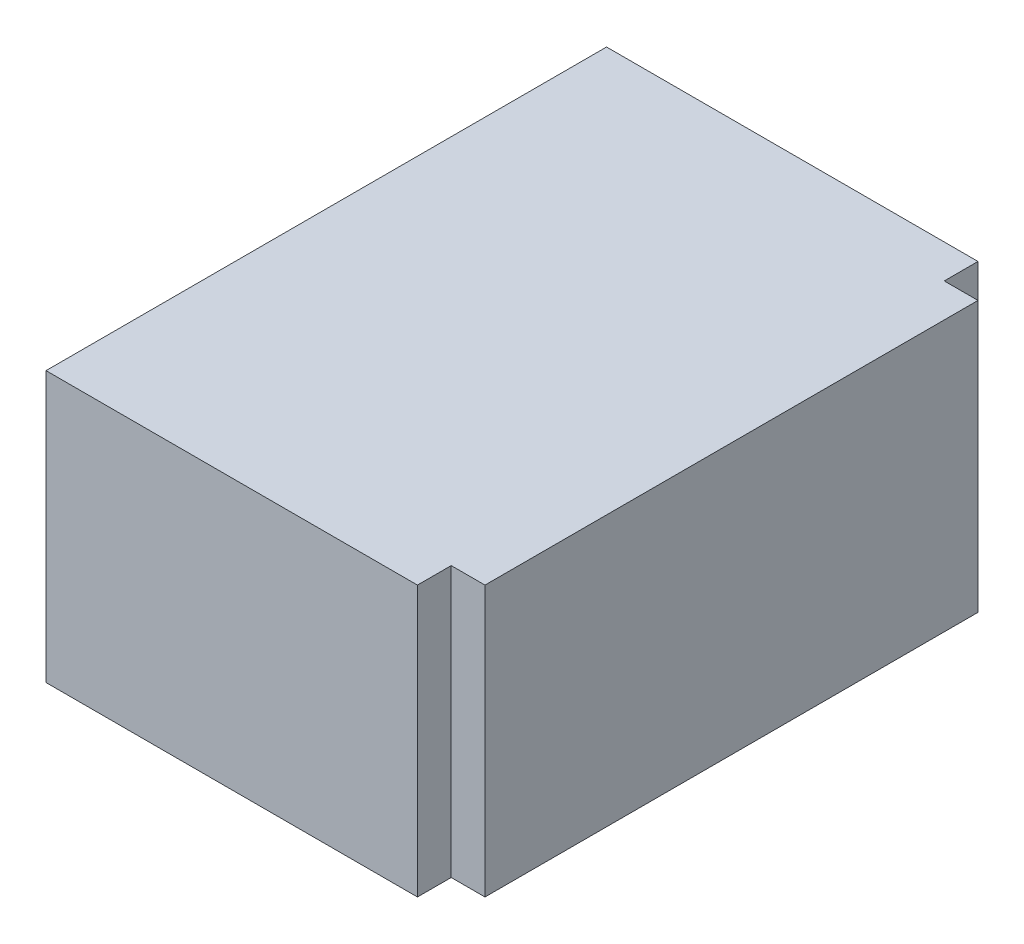
ISO-10303-21;
HEADER;
FILE_DESCRIPTION(('STEP AP214'),'2;1');
FILE_NAME('part.step','',(''),(''),'','','');
FILE_SCHEMA(('AUTOMOTIVE_DESIGN { 1 0 10303 214 1 1 1 1 }'));
ENDSEC;
DATA;
#1=APPLICATION_CONTEXT('core data for automotive mechanical design processes');
#2=APPLICATION_PROTOCOL_DEFINITION('international standard','automotive_design',2000,#1);
#3=PRODUCT_CONTEXT('',#1,'mechanical');
#4=PRODUCT('Part','Part','',(#3));
#5=PRODUCT_RELATED_PRODUCT_CATEGORY('part','',(#4));
#6=PRODUCT_DEFINITION_FORMATION('','',#4);
#7=PRODUCT_DEFINITION_CONTEXT('part definition',#1,'design');
#8=PRODUCT_DEFINITION('design','',#6,#7);
#9=PRODUCT_DEFINITION_SHAPE('','',#8);
#10=(LENGTH_UNIT() NAMED_UNIT(*) SI_UNIT(.MILLI.,.METRE.));
#11=(NAMED_UNIT(*) PLANE_ANGLE_UNIT() SI_UNIT($,.RADIAN.));
#12=(NAMED_UNIT(*) SI_UNIT($,.STERADIAN.) SOLID_ANGLE_UNIT());
#13=UNCERTAINTY_MEASURE_WITH_UNIT(LENGTH_MEASURE(1.E-05),#10,'distance_accuracy_value','');
#14=(GEOMETRIC_REPRESENTATION_CONTEXT(3) GLOBAL_UNCERTAINTY_ASSIGNED_CONTEXT((#13)) GLOBAL_UNIT_ASSIGNED_CONTEXT((#10,
#11,#12)) REPRESENTATION_CONTEXT('',''));
#15=CARTESIAN_POINT('',(0.,0.,0.));
#16=DIRECTION('',(0.,0.,1.));
#17=DIRECTION('',(1.,0.,0.));
#18=AXIS2_PLACEMENT_3D('',#15,#16,#17);
#19=CARTESIAN_POINT('',(-5.,0.402182955516719,-4.91231665760501));
#20=DIRECTION('',(1.,0.,0.));
#21=DIRECTION('',(0.,0.,-1.));
#22=AXIS2_PLACEMENT_3D('',#19,#20,#21);
#23=PLANE('',#22);
#24=DIRECTION('',(0.,-0.206333700962019,-0.978481682939091));
#25=VECTOR('',#24,1.);
#26=CARTESIAN_POINT('',(-5.,-0.672010625915505,-3.94824120259998));
#27=LINE('',#26,#25);
#28=CARTESIAN_POINT('',(-5.,-0.672010625915505,-3.94824120259998));
#29=VERTEX_POINT('',#28);
#30=CARTESIAN_POINT('',(-5.,-0.374193581432222,-2.53592454499497));
#31=VERTEX_POINT('',#30);
#32=EDGE_CURVE('E279',#29,#31,#27,.F.);
#33=ORIENTED_EDGE('',*,*,#32,.T.);
#34=DIRECTION('',(0.,-0.950556845044013,-0.310550614779576));
#35=VECTOR('',#34,1.);
#36=CARTESIAN_POINT('',(-5.,-0.374193581432222,-2.53592454499497));
#37=LINE('',#36,#35);
#38=CARTESIAN_POINT('',(-5.,0.997817044483285,-2.08768334239499));
#39=VERTEX_POINT('',#38);
#40=EDGE_CURVE('E285',#31,#39,#37,.F.);
#41=ORIENTED_EDGE('',*,*,#40,.T.);
#42=DIRECTION('',(0.,-0.744223144081993,0.667931068159516));
#43=VECTOR('',#42,1.);
#44=CARTESIAN_POINT('',(-5.,0.997817044483285,-2.08768334239499));
#45=LINE('',#44,#43);
#46=CARTESIAN_POINT('',(-5.,2.07201062591551,-3.05175879740002));
#47=VERTEX_POINT('',#46);
#48=EDGE_CURVE('E291',#39,#47,#45,.F.);
#49=ORIENTED_EDGE('',*,*,#48,.T.);
#50=DIRECTION('',(0.,0.20633370096202,0.978481682939091));
#51=VECTOR('',#50,1.);
#52=CARTESIAN_POINT('',(-5.,2.07201062591551,-3.05175879740002));
#53=LINE('',#52,#51);
#54=CARTESIAN_POINT('',(-5.,1.77419358143222,-4.46407545500503));
#55=VERTEX_POINT('',#54);
#56=EDGE_CURVE('E170',#47,#55,#53,.F.);
#57=ORIENTED_EDGE('',*,*,#56,.T.);
#58=DIRECTION('',(0.,0.950556845044013,0.310550614779576));
#59=VECTOR('',#58,1.);
#60=CARTESIAN_POINT('',(-5.,1.77419358143222,-4.46407545500503));
#61=LINE('',#60,#59);
#62=CARTESIAN_POINT('',(-5.,0.402182955516719,-4.91231665760501));
#63=VERTEX_POINT('',#62);
#64=EDGE_CURVE('E152',#55,#63,#61,.F.);
#65=ORIENTED_EDGE('',*,*,#64,.T.);
#66=DIRECTION('',(0.,0.744223144081994,-0.667931068159516));
#67=VECTOR('',#66,1.);
#68=CARTESIAN_POINT('',(-5.,0.402182955516719,-4.91231665760501));
#69=LINE('',#68,#67);
#70=EDGE_CURVE('E158',#63,#29,#69,.F.);
#71=ORIENTED_EDGE('',*,*,#70,.T.);
#72=EDGE_LOOP('',(#33,#41,#49,#57,#65,#71));
#73=FACE_BOUND('',#72,.T.);
#74=ADVANCED_FACE('F16',(#73),#23,.F.);
#75=CARTESIAN_POINT('',(-5.,-0.743270718999248,3.51740589017356));
#76=DIRECTION('',(1.,0.,0.));
#77=DIRECTION('',(0.,0.,-1.));
#78=AXIS2_PLACEMENT_3D('',#75,#76,#77);
#79=PLANE('',#78);
#80=DIRECTION('',(0.,-0.999927285753263,0.0120591544526271));
#81=VECTOR('',#80,1.);
#82=CARTESIAN_POINT('',(-5.,-0.00656141643384333,4.75861205227836));
#83=LINE('',#82,#81);
#84=CARTESIAN_POINT('',(-5.,-0.0065614164338432,4.75861205227836));
#85=VERTEX_POINT('',#84);
#86=CARTESIAN_POINT('',(-5.,1.43670930256541,4.7412061621048));
#87=VERTEX_POINT('',#86);
#88=EDGE_CURVE('E244',#85,#87,#83,.F.);
#89=ORIENTED_EDGE('',*,*,#88,.T.);
#90=DIRECTION('',(0.,-0.489520108772496,0.871992008625861));
#91=VECTOR('',#90,1.);
#92=CARTESIAN_POINT('',(-5.,1.43670930256541,4.7412061621048));
#93=LINE('',#92,#91);
#94=CARTESIAN_POINT('',(-5.,2.14327071899925,3.48259410982644));
#95=VERTEX_POINT('',#94);
#96=EDGE_CURVE('E253',#87,#95,#93,.F.);
#97=ORIENTED_EDGE('',*,*,#96,.T.);
#98=DIRECTION('',(0.,0.510407176980768,0.859932854173233));
#99=VECTOR('',#98,1.);
#100=CARTESIAN_POINT('',(-5.,2.14327071899925,3.48259410982644));
#101=LINE('',#100,#99);
#102=CARTESIAN_POINT('',(-5.,1.40656141643384,2.24138794772164));
#103=VERTEX_POINT('',#102);
#104=EDGE_CURVE('E259',#95,#103,#101,.F.);
#105=ORIENTED_EDGE('',*,*,#104,.T.);
#106=DIRECTION('',(0.,0.999927285753263,-0.0120591544526262));
#107=VECTOR('',#106,1.);
#108=CARTESIAN_POINT('',(-5.,1.40656141643384,2.24138794772164));
#109=LINE('',#108,#107);
#110=CARTESIAN_POINT('',(-5.,-0.0367093025654058,2.2587938378952));
#111=VERTEX_POINT('',#110);
#112=EDGE_CURVE('E265',#103,#111,#109,.F.);
#113=ORIENTED_EDGE('',*,*,#112,.T.);
#114=DIRECTION('',(0.,0.489520108772496,-0.871992008625861));
#115=VECTOR('',#114,1.);
#116=CARTESIAN_POINT('',(-5.,-0.0367093025654059,2.2587938378952));
#117=LINE('',#116,#115);
#118=CARTESIAN_POINT('',(-5.,-0.743270718999248,3.51740589017356));
#119=VERTEX_POINT('',#118);
#120=EDGE_CURVE('E271',#111,#119,#117,.F.);
#121=ORIENTED_EDGE('',*,*,#120,.T.);
#122=DIRECTION('',(0.,-0.510407176980767,-0.859932854173234));
#123=VECTOR('',#122,1.);
#124=CARTESIAN_POINT('',(-5.,-0.743270718999248,3.51740589017356));
#125=LINE('',#124,#123);
#126=EDGE_CURVE('E274',#119,#85,#125,.F.);
#127=ORIENTED_EDGE('',*,*,#126,.T.);
#128=EDGE_LOOP('',(#89,#97,#105,#113,#121,#127));
#129=FACE_BOUND('',#128,.T.);
#130=ADVANCED_FACE('F620',(#129),#79,.F.);
#131=CARTESIAN_POINT('',(-5.,0.402182955516719,-4.91231665760501));
#132=DIRECTION('',(0.,-0.667931068159516,-0.744223144081994));
#133=DIRECTION('',(0.,0.744223144081994,-0.667931068159516));
#134=AXIS2_PLACEMENT_3D('',#131,#132,#133);
#135=PLANE('',#134);
#136=DIRECTION('',(1.,0.,0.));
#137=VECTOR('',#136,1.);
#138=CARTESIAN_POINT('',(-5.,-0.672010625915505,-3.94824120259998));
#139=LINE('',#138,#137);
#140=CARTESIAN_POINT('',(-6.,-0.672010625915505,-3.94824120259998));
#141=VERTEX_POINT('',#140);
#142=EDGE_CURVE('E163',#141,#29,#139,.T.);
#143=ORIENTED_EDGE('',*,*,#142,.T.);
#144=ORIENTED_EDGE('',*,*,#70,.F.);
#145=DIRECTION('',(1.,0.,0.));
#146=VECTOR('',#145,1.);
#147=CARTESIAN_POINT('',(-5.,0.402182955516719,-4.91231665760501));
#148=LINE('',#147,#146);
#149=CARTESIAN_POINT('',(-6.,0.402182955516719,-4.91231665760501));
#150=VERTEX_POINT('',#149);
#151=EDGE_CURVE('E161',#63,#150,#148,.F.);
#152=ORIENTED_EDGE('',*,*,#151,.T.);
#153=DIRECTION('',(0.,0.744223144081994,-0.667931068159516));
#154=VECTOR('',#153,1.);
#155=CARTESIAN_POINT('',(-6.,-0.672010625915505,-3.94824120259998));
#156=LINE('',#155,#154);
#157=EDGE_CURVE('E239',#141,#150,#156,.T.);
#158=ORIENTED_EDGE('',*,*,#157,.F.);
#159=EDGE_LOOP('',(#143,#144,#152,#158));
#160=FACE_BOUND('',#159,.T.);
#161=ADVANCED_FACE('F159',(#160),#135,.F.);
#162=CARTESIAN_POINT('',(-5.,1.77419358143222,-4.46407545500503));
#163=DIRECTION('',(0.,0.310550614779576,-0.950556845044013));
#164=DIRECTION('',(0.,0.950556845044013,0.310550614779576));
#165=AXIS2_PLACEMENT_3D('',#162,#163,#164);
#166=PLANE('',#165);
#167=ORIENTED_EDGE('',*,*,#151,.F.);
#168=ORIENTED_EDGE('',*,*,#64,.F.);
#169=DIRECTION('',(1.,0.,0.));
#170=VECTOR('',#169,1.);
#171=CARTESIAN_POINT('',(-5.,1.77419358143222,-4.46407545500503));
#172=LINE('',#171,#170);
#173=CARTESIAN_POINT('',(-6.,1.77419358143222,-4.46407545500503));
#174=VERTEX_POINT('',#173);
#175=EDGE_CURVE('E293',#55,#174,#172,.F.);
#176=ORIENTED_EDGE('',*,*,#175,.T.);
#177=DIRECTION('',(0.,0.950556845044013,0.310550614779576));
#178=VECTOR('',#177,1.);
#179=CARTESIAN_POINT('',(-6.,0.402182955516719,-4.91231665760501));
#180=LINE('',#179,#178);
#181=EDGE_CURVE('E169',#150,#174,#180,.T.);
#182=ORIENTED_EDGE('',*,*,#181,.F.);
#183=EDGE_LOOP('',(#167,#168,#176,#182));
#184=FACE_BOUND('',#183,.T.);
#185=ADVANCED_FACE('F168',(#184),#166,.F.);
#186=CARTESIAN_POINT('',(-5.,2.07201062591551,-3.05175879740002));
#187=DIRECTION('',(0.,0.978481682939091,-0.20633370096202));
#188=DIRECTION('',(0.,0.20633370096202,0.978481682939091));
#189=AXIS2_PLACEMENT_3D('',#186,#187,#188);
#190=PLANE('',#189);
#191=ORIENTED_EDGE('',*,*,#175,.F.);
#192=ORIENTED_EDGE('',*,*,#56,.F.);
#193=DIRECTION('',(1.,0.,0.));
#194=VECTOR('',#193,1.);
#195=CARTESIAN_POINT('',(-5.,2.07201062591551,-3.05175879740002));
#196=LINE('',#195,#194);
#197=CARTESIAN_POINT('',(-6.,2.07201062591551,-3.05175879740002));
#198=VERTEX_POINT('',#197);
#199=EDGE_CURVE('E288',#47,#198,#196,.F.);
#200=ORIENTED_EDGE('',*,*,#199,.T.);
#201=DIRECTION('',(0.,0.20633370096202,0.978481682939091));
#202=VECTOR('',#201,1.);
#203=CARTESIAN_POINT('',(-6.,1.77419358143222,-4.46407545500503));
#204=LINE('',#203,#202);
#205=EDGE_CURVE('E236',#174,#198,#204,.T.);
#206=ORIENTED_EDGE('',*,*,#205,.F.);
#207=EDGE_LOOP('',(#191,#192,#200,#206));
#208=FACE_BOUND('',#207,.T.);
#209=ADVANCED_FACE('F296',(#208),#190,.F.);
#210=CARTESIAN_POINT('',(-5.,0.997817044483285,-2.08768334239499));
#211=DIRECTION('',(0.,0.667931068159516,0.744223144081993));
#212=DIRECTION('',(0.,-0.744223144081993,0.667931068159516));
#213=AXIS2_PLACEMENT_3D('',#210,#211,#212);
#214=PLANE('',#213);
#215=ORIENTED_EDGE('',*,*,#199,.F.);
#216=ORIENTED_EDGE('',*,*,#48,.F.);
#217=DIRECTION('',(1.,0.,0.));
#218=VECTOR('',#217,1.);
#219=CARTESIAN_POINT('',(-5.,0.997817044483285,-2.08768334239499));
#220=LINE('',#219,#218);
#221=CARTESIAN_POINT('',(-6.,0.997817044483285,-2.08768334239499));
#222=VERTEX_POINT('',#221);
#223=EDGE_CURVE('E282',#39,#222,#220,.F.);
#224=ORIENTED_EDGE('',*,*,#223,.T.);
#225=DIRECTION('',(0.,-0.744223144081993,0.667931068159517));
#226=VECTOR('',#225,1.);
#227=CARTESIAN_POINT('',(-6.,2.07201062591551,-3.05175879740002));
#228=LINE('',#227,#226);
#229=EDGE_CURVE('E234',#198,#222,#228,.T.);
#230=ORIENTED_EDGE('',*,*,#229,.F.);
#231=EDGE_LOOP('',(#215,#216,#224,#230));
#232=FACE_BOUND('',#231,.T.);
#233=ADVANCED_FACE('F310',(#232),#214,.F.);
#234=CARTESIAN_POINT('',(-5.,-0.374193581432222,-2.53592454499497));
#235=DIRECTION('',(0.,-0.310550614779576,0.950556845044013));
#236=DIRECTION('',(0.,-0.950556845044013,-0.310550614779576));
#237=AXIS2_PLACEMENT_3D('',#234,#235,#236);
#238=PLANE('',#237);
#239=ORIENTED_EDGE('',*,*,#223,.F.);
#240=ORIENTED_EDGE('',*,*,#40,.F.);
#241=DIRECTION('',(1.,0.,0.));
#242=VECTOR('',#241,1.);
#243=CARTESIAN_POINT('',(-5.,-0.374193581432222,-2.53592454499497));
#244=LINE('',#243,#242);
#245=CARTESIAN_POINT('',(-6.,-0.374193581432222,-2.53592454499497));
#246=VERTEX_POINT('',#245);
#247=EDGE_CURVE('E276',#31,#246,#244,.F.);
#248=ORIENTED_EDGE('',*,*,#247,.T.);
#249=DIRECTION('',(0.,-0.950556845044013,-0.310550614779576));
#250=VECTOR('',#249,1.);
#251=CARTESIAN_POINT('',(-6.,0.997817044483285,-2.08768334239499));
#252=LINE('',#251,#250);
#253=EDGE_CURVE('E232',#222,#246,#252,.T.);
#254=ORIENTED_EDGE('',*,*,#253,.F.);
#255=EDGE_LOOP('',(#239,#240,#248,#254));
#256=FACE_BOUND('',#255,.T.);
#257=ADVANCED_FACE('F308',(#256),#238,.F.);
#258=CARTESIAN_POINT('',(-5.,-0.672010625915505,-3.94824120259998));
#259=DIRECTION('',(0.,-0.978481682939091,0.206333700962019));
#260=DIRECTION('',(0.,-0.206333700962019,-0.978481682939091));
#261=AXIS2_PLACEMENT_3D('',#258,#259,#260);
#262=PLANE('',#261);
#263=ORIENTED_EDGE('',*,*,#247,.F.);
#264=ORIENTED_EDGE('',*,*,#32,.F.);
#265=ORIENTED_EDGE('',*,*,#142,.F.);
#266=DIRECTION('',(0.,-0.206333700962019,-0.978481682939091));
#267=VECTOR('',#266,1.);
#268=CARTESIAN_POINT('',(-6.,-0.374193581432222,-2.53592454499497));
#269=LINE('',#268,#267);
#270=EDGE_CURVE('E229',#246,#141,#269,.T.);
#271=ORIENTED_EDGE('',*,*,#270,.F.);
#272=EDGE_LOOP('',(#263,#264,#265,#271));
#273=FACE_BOUND('',#272,.T.);
#274=ADVANCED_FACE('F305',(#273),#262,.F.);
#275=CARTESIAN_POINT('',(-5.,-0.743270718999248,3.51740589017356));
#276=DIRECTION('',(0.,-0.859932854173234,0.510407176980767));
#277=DIRECTION('',(0.,-0.510407176980767,-0.859932854173234));
#278=AXIS2_PLACEMENT_3D('',#275,#276,#277);
#279=PLANE('',#278);
#280=DIRECTION('',(1.,0.,0.));
#281=VECTOR('',#280,1.);
#282=CARTESIAN_POINT('',(-5.,-0.00656141643384336,4.75861205227836));
#283=LINE('',#282,#281);
#284=CARTESIAN_POINT('',(-6.,-0.0065614164338432,4.75861205227836));
#285=VERTEX_POINT('',#284);
#286=EDGE_CURVE('E247',#285,#85,#283,.T.);
#287=ORIENTED_EDGE('',*,*,#286,.T.);
#288=ORIENTED_EDGE('',*,*,#126,.F.);
#289=DIRECTION('',(1.,0.,0.));
#290=VECTOR('',#289,1.);
#291=CARTESIAN_POINT('',(-5.,-0.743270718999248,3.51740589017356));
#292=LINE('',#291,#290);
#293=CARTESIAN_POINT('',(-6.,-0.743270718999248,3.51740589017356));
#294=VERTEX_POINT('',#293);
#295=EDGE_CURVE('E268',#119,#294,#292,.F.);
#296=ORIENTED_EDGE('',*,*,#295,.T.);
#297=DIRECTION('',(0.,-0.510407176980766,-0.859932854173234));
#298=VECTOR('',#297,1.);
#299=CARTESIAN_POINT('',(-6.,-0.00656141643384333,4.75861205227836));
#300=LINE('',#299,#298);
#301=EDGE_CURVE('E227',#285,#294,#300,.T.);
#302=ORIENTED_EDGE('',*,*,#301,.F.);
#303=EDGE_LOOP('',(#287,#288,#296,#302));
#304=FACE_BOUND('',#303,.T.);
#305=ADVANCED_FACE('F419',(#304),#279,.F.);
#306=CARTESIAN_POINT('',(-5.,-0.0367093025654059,2.2587938378952));
#307=DIRECTION('',(0.,-0.871992008625861,-0.489520108772496));
#308=DIRECTION('',(0.,0.489520108772496,-0.871992008625861));
#309=AXIS2_PLACEMENT_3D('',#306,#307,#308);
#310=PLANE('',#309);
#311=ORIENTED_EDGE('',*,*,#295,.F.);
#312=ORIENTED_EDGE('',*,*,#120,.F.);
#313=DIRECTION('',(1.,0.,0.));
#314=VECTOR('',#313,1.);
#315=CARTESIAN_POINT('',(-5.,-0.0367093025654059,2.2587938378952));
#316=LINE('',#315,#314);
#317=CARTESIAN_POINT('',(-6.,-0.0367093025654059,2.2587938378952));
#318=VERTEX_POINT('',#317);
#319=EDGE_CURVE('E262',#111,#318,#316,.F.);
#320=ORIENTED_EDGE('',*,*,#319,.T.);
#321=DIRECTION('',(0.,0.489520108772496,-0.871992008625861));
#322=VECTOR('',#321,1.);
#323=CARTESIAN_POINT('',(-6.,-0.743270718999248,3.51740589017356));
#324=LINE('',#323,#322);
#325=EDGE_CURVE('E225',#294,#318,#324,.T.);
#326=ORIENTED_EDGE('',*,*,#325,.F.);
#327=EDGE_LOOP('',(#311,#312,#320,#326));
#328=FACE_BOUND('',#327,.T.);
#329=ADVANCED_FACE('F415',(#328),#310,.F.);
#330=CARTESIAN_POINT('',(-5.,1.40656141643384,2.24138794772164));
#331=DIRECTION('',(0.,-0.0120591544526262,-0.999927285753263));
#332=DIRECTION('',(0.,0.999927285753263,-0.0120591544526262));
#333=AXIS2_PLACEMENT_3D('',#330,#331,#332);
#334=PLANE('',#333);
#335=ORIENTED_EDGE('',*,*,#319,.F.);
#336=ORIENTED_EDGE('',*,*,#112,.F.);
#337=DIRECTION('',(1.,0.,0.));
#338=VECTOR('',#337,1.);
#339=CARTESIAN_POINT('',(-5.,1.40656141643384,2.24138794772164));
#340=LINE('',#339,#338);
#341=CARTESIAN_POINT('',(-6.,1.40656141643384,2.24138794772164));
#342=VERTEX_POINT('',#341);
#343=EDGE_CURVE('E256',#103,#342,#340,.F.);
#344=ORIENTED_EDGE('',*,*,#343,.T.);
#345=DIRECTION('',(0.,0.999927285753263,-0.0120591544526262));
#346=VECTOR('',#345,1.);
#347=CARTESIAN_POINT('',(-6.,-0.0367093025654059,2.2587938378952));
#348=LINE('',#347,#346);
#349=EDGE_CURVE('E223',#318,#342,#348,.T.);
#350=ORIENTED_EDGE('',*,*,#349,.F.);
#351=EDGE_LOOP('',(#335,#336,#344,#350));
#352=FACE_BOUND('',#351,.T.);
#353=ADVANCED_FACE('F411',(#352),#334,.F.);
#354=CARTESIAN_POINT('',(-5.,2.14327071899925,3.48259410982644));
#355=DIRECTION('',(0.,0.859932854173233,-0.510407176980768));
#356=DIRECTION('',(0.,0.510407176980768,0.859932854173233));
#357=AXIS2_PLACEMENT_3D('',#354,#355,#356);
#358=PLANE('',#357);
#359=ORIENTED_EDGE('',*,*,#343,.F.);
#360=ORIENTED_EDGE('',*,*,#104,.F.);
#361=DIRECTION('',(1.,0.,0.));
#362=VECTOR('',#361,1.);
#363=CARTESIAN_POINT('',(-5.,2.14327071899925,3.48259410982644));
#364=LINE('',#363,#362);
#365=CARTESIAN_POINT('',(-6.,2.14327071899925,3.48259410982644));
#366=VERTEX_POINT('',#365);
#367=EDGE_CURVE('E250',#95,#366,#364,.F.);
#368=ORIENTED_EDGE('',*,*,#367,.T.);
#369=DIRECTION('',(0.,0.510407176980767,0.859932854173233));
#370=VECTOR('',#369,1.);
#371=CARTESIAN_POINT('',(-6.,1.40656141643384,2.24138794772164));
#372=LINE('',#371,#370);
#373=EDGE_CURVE('E218',#342,#366,#372,.T.);
#374=ORIENTED_EDGE('',*,*,#373,.F.);
#375=EDGE_LOOP('',(#359,#360,#368,#374));
#376=FACE_BOUND('',#375,.T.);
#377=ADVANCED_FACE('F407',(#376),#358,.F.);
#378=CARTESIAN_POINT('',(-5.,1.43670930256541,4.7412061621048));
#379=DIRECTION('',(0.,0.871992008625861,0.489520108772496));
#380=DIRECTION('',(0.,-0.489520108772496,0.871992008625861));
#381=AXIS2_PLACEMENT_3D('',#378,#379,#380);
#382=PLANE('',#381);
#383=ORIENTED_EDGE('',*,*,#367,.F.);
#384=ORIENTED_EDGE('',*,*,#96,.F.);
#385=DIRECTION('',(1.,0.,0.));
#386=VECTOR('',#385,1.);
#387=CARTESIAN_POINT('',(-5.,1.43670930256541,4.7412061621048));
#388=LINE('',#387,#386);
#389=CARTESIAN_POINT('',(-6.,1.43670930256541,4.7412061621048));
#390=VERTEX_POINT('',#389);
#391=EDGE_CURVE('E241',#87,#390,#388,.F.);
#392=ORIENTED_EDGE('',*,*,#391,.T.);
#393=DIRECTION('',(0.,-0.489520108772496,0.871992008625861));
#394=VECTOR('',#393,1.);
#395=CARTESIAN_POINT('',(-6.,2.14327071899925,3.48259410982644));
#396=LINE('',#395,#394);
#397=EDGE_CURVE('E213',#366,#390,#396,.T.);
#398=ORIENTED_EDGE('',*,*,#397,.F.);
#399=EDGE_LOOP('',(#383,#384,#392,#398));
#400=FACE_BOUND('',#399,.T.);
#401=ADVANCED_FACE('F403',(#400),#382,.F.);
#402=CARTESIAN_POINT('',(-5.,-0.00656141643384333,4.75861205227836));
#403=DIRECTION('',(0.,0.0120591544526271,0.999927285753263));
#404=DIRECTION('',(0.,-0.999927285753263,0.0120591544526271));
#405=AXIS2_PLACEMENT_3D('',#402,#403,#404);
#406=PLANE('',#405);
#407=ORIENTED_EDGE('',*,*,#391,.F.);
#408=ORIENTED_EDGE('',*,*,#88,.F.);
#409=ORIENTED_EDGE('',*,*,#286,.F.);
#410=DIRECTION('',(0.,-0.999927285753263,0.0120591544526283));
#411=VECTOR('',#410,1.);
#412=CARTESIAN_POINT('',(-6.,1.43670930256541,4.7412061621048));
#413=LINE('',#412,#411);
#414=EDGE_CURVE('E209',#390,#285,#413,.T.);
#415=ORIENTED_EDGE('',*,*,#414,.F.);
#416=EDGE_LOOP('',(#407,#408,#409,#415));
#417=FACE_BOUND('',#416,.T.);
#418=ADVANCED_FACE('F399',(#417),#406,.F.);
#419=CARTESIAN_POINT('',(-6.,0.7,-3.5));
#420=DIRECTION('',(-1.,0.,0.));
#421=DIRECTION('',(0.,0.,1.));
#422=AXIS2_PLACEMENT_3D('',#419,#420,#421);
#423=PLANE('',#422);
#424=CARTESIAN_POINT('',(-5.99999999991496,0.7,-3.5));
#425=DIRECTION('',(1.,0.,0.));
#426=DIRECTION('',(0.,0.,-1.));
#427=AXIS2_PLACEMENT_3D('',#424,#425,#426);
#428=CIRCLE('',#427,2.47499999997808);
#429=CARTESIAN_POINT('',(-5.99999999991496,0.7,-5.97499999997808));
#430=VERTEX_POINT('',#429);
#431=EDGE_CURVE('E19',#430,#430,#428,.T.);
#432=ORIENTED_EDGE('',*,*,#431,.F.);
#433=EDGE_LOOP('',(#432));
#434=FACE_BOUND('',#433,.T.);
#435=ORIENTED_EDGE('',*,*,#253,.T.);
#436=ORIENTED_EDGE('',*,*,#270,.T.);
#437=ORIENTED_EDGE('',*,*,#157,.T.);
#438=ORIENTED_EDGE('',*,*,#181,.T.);
#439=ORIENTED_EDGE('',*,*,#205,.T.);
#440=ORIENTED_EDGE('',*,*,#229,.T.);
#441=EDGE_LOOP('',(#435,#436,#437,#438,#439,#440));
#442=FACE_BOUND('',#441,.T.);
#443=ADVANCED_FACE('F300',(#434,#442),#423,.T.);
#444=CARTESIAN_POINT('',(-6.,0.7,3.5));
#445=DIRECTION('',(-1.,0.,0.));
#446=DIRECTION('',(0.,0.,1.));
#447=AXIS2_PLACEMENT_3D('',#444,#445,#446);
#448=PLANE('',#447);
#449=CARTESIAN_POINT('',(-5.99999999997181,0.7,3.5));
#450=DIRECTION('',(1.,0.,0.));
#451=DIRECTION('',(0.,0.,-1.));
#452=AXIS2_PLACEMENT_3D('',#449,#450,#451);
#453=CIRCLE('',#452,2.47500000002992);
#454=CARTESIAN_POINT('',(-5.99999999997181,0.7,1.02499999997008));
#455=VERTEX_POINT('',#454);
#456=EDGE_CURVE('E201',#455,#455,#453,.T.);
#457=ORIENTED_EDGE('',*,*,#456,.F.);
#458=EDGE_LOOP('',(#457));
#459=FACE_BOUND('',#458,.T.);
#460=ORIENTED_EDGE('',*,*,#397,.T.);
#461=ORIENTED_EDGE('',*,*,#414,.T.);
#462=ORIENTED_EDGE('',*,*,#301,.T.);
#463=ORIENTED_EDGE('',*,*,#325,.T.);
#464=ORIENTED_EDGE('',*,*,#349,.T.);
#465=ORIENTED_EDGE('',*,*,#373,.T.);
#466=EDGE_LOOP('',(#460,#461,#462,#463,#464,#465));
#467=FACE_BOUND('',#466,.T.);
#468=ADVANCED_FACE('F393',(#459,#467),#448,.T.);
#469=CARTESIAN_POINT('',(-5.72499999992715,0.7,-3.5));
#470=DIRECTION('',(1.,0.,0.));
#471=DIRECTION('',(0.,0.,-1.));
#472=AXIS2_PLACEMENT_3D('',#469,#470,#471);
#473=CONICAL_SURFACE('',#472,2.74999999996589,0.785398163397448);
#474=ORIENTED_EDGE('',*,*,#431,.T.);
#475=EDGE_LOOP('',(#474));
#476=FACE_BOUND('',#475,.T.);
#477=CARTESIAN_POINT('',(-5.725,0.7,-3.5));
#478=DIRECTION('',(1.,0.,0.));
#479=DIRECTION('',(0.,0.,-1.));
#480=AXIS2_PLACEMENT_3D('',#477,#478,#479);
#481=CIRCLE('',#480,2.75);
#482=CARTESIAN_POINT('',(-5.725,0.7,-6.25));
#483=VERTEX_POINT('',#482);
#484=EDGE_CURVE('E203',#483,#483,#481,.T.);
#485=ORIENTED_EDGE('',*,*,#484,.F.);
#486=EDGE_LOOP('',(#485));
#487=FACE_BOUND('',#486,.T.);
#488=ADVANCED_FACE('F389',(#476,#487),#473,.T.);
#489=CARTESIAN_POINT('',(-5.72499999987031,0.7,3.5));
#490=DIRECTION('',(1.,0.,0.));
#491=DIRECTION('',(0.,0.,-1.));
#492=AXIS2_PLACEMENT_3D('',#489,#490,#491);
#493=CONICAL_SURFACE('',#492,2.75000000007458,0.785398163294097);
#494=CARTESIAN_POINT('',(-5.725,0.7,3.5));
#495=DIRECTION('',(1.,0.,0.));
#496=DIRECTION('',(0.,0.,-1.));
#497=AXIS2_PLACEMENT_3D('',#494,#495,#496);
#498=CIRCLE('',#497,2.75);
#499=CARTESIAN_POINT('',(-5.725,0.7,0.75));
#500=VERTEX_POINT('',#499);
#501=EDGE_CURVE('E200',#500,#500,#498,.T.);
#502=ORIENTED_EDGE('',*,*,#501,.F.);
#503=EDGE_LOOP('',(#502));
#504=FACE_BOUND('',#503,.T.);
#505=ORIENTED_EDGE('',*,*,#456,.T.);
#506=EDGE_LOOP('',(#505));
#507=FACE_BOUND('',#506,.T.);
#508=ADVANCED_FACE('F385',(#504,#507),#493,.T.);
#509=CARTESIAN_POINT('',(-6.,0.7,-3.5));
#510=DIRECTION('',(1.,0.,0.));
#511=DIRECTION('',(0.,0.,-1.));
#512=AXIS2_PLACEMENT_3D('',#509,#510,#511);
#513=CYLINDRICAL_SURFACE('',#512,2.75);
#514=ORIENTED_EDGE('',*,*,#484,.T.);
#515=EDGE_LOOP('',(#514));
#516=FACE_BOUND('',#515,.T.);
#517=CARTESIAN_POINT('',(-4.,0.7,-3.5));
#518=DIRECTION('',(1.,0.,0.));
#519=DIRECTION('',(0.,0.,-1.));
#520=AXIS2_PLACEMENT_3D('',#517,#518,#519);
#521=CIRCLE('',#520,2.75);
#522=CARTESIAN_POINT('',(-4.,0.7,-6.25));
#523=VERTEX_POINT('',#522);
#524=EDGE_CURVE('E198',#523,#523,#521,.F.);
#525=ORIENTED_EDGE('',*,*,#524,.T.);
#526=EDGE_LOOP('',(#525));
#527=FACE_BOUND('',#526,.T.);
#528=ADVANCED_FACE('F381',(#516,#527),#513,.T.);
#529=CARTESIAN_POINT('',(-6.,0.7,3.5));
#530=DIRECTION('',(1.,0.,0.));
#531=DIRECTION('',(0.,0.,-1.));
#532=AXIS2_PLACEMENT_3D('',#529,#530,#531);
#533=CYLINDRICAL_SURFACE('',#532,2.75);
#534=CARTESIAN_POINT('',(-4.,0.7,3.5));
#535=DIRECTION('',(1.,0.,0.));
#536=DIRECTION('',(0.,0.,-1.));
#537=AXIS2_PLACEMENT_3D('',#534,#535,#536);
#538=CIRCLE('',#537,2.75);
#539=CARTESIAN_POINT('',(-4.,0.7,0.75));
#540=VERTEX_POINT('',#539);
#541=EDGE_CURVE('E195',#540,#540,#538,.T.);
#542=ORIENTED_EDGE('',*,*,#541,.F.);
#543=EDGE_LOOP('',(#542));
#544=FACE_BOUND('',#543,.T.);
#545=ORIENTED_EDGE('',*,*,#501,.T.);
#546=EDGE_LOOP('',(#545));
#547=FACE_BOUND('',#546,.T.);
#548=ADVANCED_FACE('F377',(#544,#547),#533,.T.);
#549=CARTESIAN_POINT('',(-4.,0.7,-3.5));
#550=DIRECTION('',(1.,0.,0.));
#551=DIRECTION('',(0.,0.,-1.));
#552=AXIS2_PLACEMENT_3D('',#549,#550,#551);
#553=PLANE('',#552);
#554=ORIENTED_EDGE('',*,*,#524,.F.);
#555=EDGE_LOOP('',(#554));
#556=FACE_BOUND('',#555,.T.);
#557=CARTESIAN_POINT('',(-4.,0.7,-3.5));
#558=DIRECTION('',(-1.,0.,0.));
#559=DIRECTION('',(0.,0.,1.));
#560=AXIS2_PLACEMENT_3D('',#557,#558,#559);
#561=CIRCLE('',#560,2.8);
#562=CARTESIAN_POINT('',(-4.,0.7,-0.699999999999999));
#563=VERTEX_POINT('',#562);
#564=EDGE_CURVE('E191',#563,#563,#561,.T.);
#565=ORIENTED_EDGE('',*,*,#564,.T.);
#566=EDGE_LOOP('',(#565));
#567=FACE_BOUND('',#566,.T.);
#568=ADVANCED_FACE('F373',(#556,#567),#553,.F.);
#569=CARTESIAN_POINT('',(-4.,0.7,3.5));
#570=DIRECTION('',(-1.,0.,0.));
#571=DIRECTION('',(0.,0.,1.));
#572=AXIS2_PLACEMENT_3D('',#569,#570,#571);
#573=PLANE('',#572);
#574=ORIENTED_EDGE('',*,*,#541,.T.);
#575=EDGE_LOOP('',(#574));
#576=FACE_BOUND('',#575,.T.);
#577=CARTESIAN_POINT('',(-4.,0.7,3.5));
#578=DIRECTION('',(-1.,0.,0.));
#579=DIRECTION('',(0.,0.,1.));
#580=AXIS2_PLACEMENT_3D('',#577,#578,#579);
#581=CIRCLE('',#580,2.8);
#582=CARTESIAN_POINT('',(-4.,0.7,6.3));
#583=VERTEX_POINT('',#582);
#584=EDGE_CURVE('E187',#583,#583,#581,.T.);
#585=ORIENTED_EDGE('',*,*,#584,.T.);
#586=EDGE_LOOP('',(#585));
#587=FACE_BOUND('',#586,.T.);
#588=ADVANCED_FACE('F369',(#576,#587),#573,.T.);
#589=CARTESIAN_POINT('',(5.,-15.,-7.3));
#590=DIRECTION('',(1.,0.,0.));
#591=DIRECTION('',(0.,1.,0.));
#592=AXIS2_PLACEMENT_3D('',#589,#590,#591);
#593=PLANE('',#592);
#594=DIRECTION('',(0.,0.,1.));
#595=VECTOR('',#594,1.);
#596=CARTESIAN_POINT('',(5.,4.,8.3));
#597=LINE('',#596,#595);
#598=CARTESIAN_POINT('',(5.,4.,-8.3));
#599=VERTEX_POINT('',#598);
#600=CARTESIAN_POINT('',(5.,4.,-7.3));
#601=VERTEX_POINT('',#600);
#602=EDGE_CURVE('E702',#599,#601,#597,.T.);
#603=ORIENTED_EDGE('',*,*,#602,.T.);
#604=DIRECTION('',(0.,1.,0.));
#605=VECTOR('',#604,1.);
#606=CARTESIAN_POINT('',(5.,15.,-7.3));
#607=LINE('',#606,#605);
#608=CARTESIAN_POINT('',(5.,-3.99999999999999,-7.3));
#609=VERTEX_POINT('',#608);
#610=EDGE_CURVE('E696',#601,#609,#607,.F.);
#611=ORIENTED_EDGE('',*,*,#610,.T.);
#612=DIRECTION('',(0.,0.,1.));
#613=VECTOR('',#612,1.);
#614=CARTESIAN_POINT('',(5.,-3.99999999999999,-7.3));
#615=LINE('',#614,#613);
#616=CARTESIAN_POINT('',(5.,-3.99999999999999,-8.3));
#617=VERTEX_POINT('',#616);
#618=EDGE_CURVE('E194',#609,#617,#615,.F.);
#619=ORIENTED_EDGE('',*,*,#618,.T.);
#620=DIRECTION('',(0.,1.,0.));
#621=VECTOR('',#620,1.);
#622=CARTESIAN_POINT('',(5.,-4.,-8.3));
#623=LINE('',#622,#621);
#624=EDGE_CURVE('E186',#617,#599,#623,.T.);
#625=ORIENTED_EDGE('',*,*,#624,.T.);
#626=EDGE_LOOP('',(#603,#611,#619,#625));
#627=FACE_BOUND('',#626,.T.);
#628=ADVANCED_FACE('F365',(#627),#593,.T.);
#629=CARTESIAN_POINT('',(-4.,0.7,-3.5));
#630=DIRECTION('',(-1.,0.,0.));
#631=DIRECTION('',(0.,0.,1.));
#632=AXIS2_PLACEMENT_3D('',#629,#630,#631);
#633=CYLINDRICAL_SURFACE('',#632,2.8);
#634=CARTESIAN_POINT('',(-6.,0.7,-3.5));
#635=DIRECTION('',(-1.,0.,0.));
#636=DIRECTION('',(0.,0.,1.));
#637=AXIS2_PLACEMENT_3D('',#634,#635,#636);
#638=CIRCLE('',#637,2.8);
#639=CARTESIAN_POINT('',(-6.,0.7,-0.699999999999999));
#640=VERTEX_POINT('',#639);
#641=EDGE_CURVE('E182',#640,#640,#638,.T.);
#642=ORIENTED_EDGE('',*,*,#641,.T.);
#643=EDGE_LOOP('',(#642));
#644=FACE_BOUND('',#643,.T.);
#645=ORIENTED_EDGE('',*,*,#564,.F.);
#646=EDGE_LOOP('',(#645));
#647=FACE_BOUND('',#646,.T.);
#648=ADVANCED_FACE('F361',(#644,#647),#633,.F.);
#649=CARTESIAN_POINT('',(-4.,0.7,3.5));
#650=DIRECTION('',(-1.,0.,0.));
#651=DIRECTION('',(0.,0.,1.));
#652=AXIS2_PLACEMENT_3D('',#649,#650,#651);
#653=CYLINDRICAL_SURFACE('',#652,2.8);
#654=CARTESIAN_POINT('',(-6.,0.7,3.5));
#655=DIRECTION('',(-1.,0.,0.));
#656=DIRECTION('',(0.,0.,1.));
#657=AXIS2_PLACEMENT_3D('',#654,#655,#656);
#658=CIRCLE('',#657,2.8);
#659=CARTESIAN_POINT('',(-6.,0.7,6.3));
#660=VERTEX_POINT('',#659);
#661=EDGE_CURVE('E177',#660,#660,#658,.T.);
#662=ORIENTED_EDGE('',*,*,#661,.T.);
#663=EDGE_LOOP('',(#662));
#664=FACE_BOUND('',#663,.T.);
#665=ORIENTED_EDGE('',*,*,#584,.F.);
#666=EDGE_LOOP('',(#665));
#667=FACE_BOUND('',#666,.T.);
#668=ADVANCED_FACE('F357',(#664,#667),#653,.F.);
#669=CARTESIAN_POINT('',(4.99999999999999,15.,7.3));
#670=DIRECTION('',(1.,0.,0.));
#671=DIRECTION('',(0.,1.,0.));
#672=AXIS2_PLACEMENT_3D('',#669,#670,#671);
#673=PLANE('',#672);
#674=DIRECTION('',(0.,0.,1.));
#675=VECTOR('',#674,1.);
#676=CARTESIAN_POINT('',(5.,4.,8.3));
#677=LINE('',#676,#675);
#678=CARTESIAN_POINT('',(5.,4.,7.3));
#679=VERTEX_POINT('',#678);
#680=CARTESIAN_POINT('',(5.,4.,8.3));
#681=VERTEX_POINT('',#680);
#682=EDGE_CURVE('E711',#679,#681,#677,.T.);
#683=ORIENTED_EDGE('',*,*,#682,.T.);
#684=DIRECTION('',(0.,1.,0.));
#685=VECTOR('',#684,1.);
#686=CARTESIAN_POINT('',(5.,-4.,8.3));
#687=LINE('',#686,#685);
#688=CARTESIAN_POINT('',(5.,-4.,8.3));
#689=VERTEX_POINT('',#688);
#690=EDGE_CURVE('E180',#689,#681,#687,.T.);
#691=ORIENTED_EDGE('',*,*,#690,.F.);
#692=DIRECTION('',(0.,0.,1.));
#693=VECTOR('',#692,1.);
#694=CARTESIAN_POINT('',(5.,-4.,7.3));
#695=LINE('',#694,#693);
#696=CARTESIAN_POINT('',(5.,-4.,7.3));
#697=VERTEX_POINT('',#696);
#698=EDGE_CURVE('E190',#689,#697,#695,.F.);
#699=ORIENTED_EDGE('',*,*,#698,.T.);
#700=DIRECTION('',(0.,1.,0.));
#701=VECTOR('',#700,1.);
#702=CARTESIAN_POINT('',(5.,15.,7.3));
#703=LINE('',#702,#701);
#704=EDGE_CURVE('E700',#697,#679,#703,.T.);
#705=ORIENTED_EDGE('',*,*,#704,.T.);
#706=EDGE_LOOP('',(#683,#691,#699,#705));
#707=FACE_BOUND('',#706,.T.);
#708=ADVANCED_FACE('F353',(#707),#673,.T.);
#709=CARTESIAN_POINT('',(4.99999999999999,15.,-7.3));
#710=DIRECTION('',(0.,0.,1.));
#711=DIRECTION('',(1.,0.,0.));
#712=AXIS2_PLACEMENT_3D('',#709,#710,#711);
#713=PLANE('',#712);
#714=DIRECTION('',(1.,0.,0.));
#715=VECTOR('',#714,1.);
#716=CARTESIAN_POINT('',(-6.,4.,-7.3));
#717=LINE('',#716,#715);
#718=CARTESIAN_POINT('',(6.,4.,-7.3));
#719=VERTEX_POINT('',#718);
#720=EDGE_CURVE('E705',#601,#719,#717,.T.);
#721=ORIENTED_EDGE('',*,*,#720,.T.);
#722=DIRECTION('',(0.,-1.,0.));
#723=VECTOR('',#722,1.);
#724=CARTESIAN_POINT('',(6.,4.,-7.3));
#725=LINE('',#724,#723);
#726=CARTESIAN_POINT('',(6.,-3.99999999999999,-7.3));
#727=VERTEX_POINT('',#726);
#728=EDGE_CURVE('E728',#719,#727,#725,.T.);
#729=ORIENTED_EDGE('',*,*,#728,.T.);
#730=DIRECTION('',(1.,0.,0.));
#731=VECTOR('',#730,1.);
#732=CARTESIAN_POINT('',(4.99999999999999,-3.99999999999999,-7.3));
#733=LINE('',#732,#731);
#734=EDGE_CURVE('E694',#609,#727,#733,.T.);
#735=ORIENTED_EDGE('',*,*,#734,.F.);
#736=ORIENTED_EDGE('',*,*,#610,.F.);
#737=EDGE_LOOP('',(#721,#729,#735,#736));
#738=FACE_BOUND('',#737,.T.);
#739=ADVANCED_FACE('F350',(#738),#713,.F.);
#740=CARTESIAN_POINT('',(4.99999999999999,15.,7.3));
#741=DIRECTION('',(0.,0.,-1.));
#742=DIRECTION('',(-1.,0.,0.));
#743=AXIS2_PLACEMENT_3D('',#740,#741,#742);
#744=PLANE('',#743);
#745=DIRECTION('',(1.,0.,0.));
#746=VECTOR('',#745,1.);
#747=CARTESIAN_POINT('',(-6.,4.,7.3));
#748=LINE('',#747,#746);
#749=CARTESIAN_POINT('',(6.,4.,7.3));
#750=VERTEX_POINT('',#749);
#751=EDGE_CURVE('E708',#750,#679,#748,.F.);
#752=ORIENTED_EDGE('',*,*,#751,.T.);
#753=ORIENTED_EDGE('',*,*,#704,.F.);
#754=DIRECTION('',(-1.,0.,0.));
#755=VECTOR('',#754,1.);
#756=CARTESIAN_POINT('',(4.99999999999999,-3.99999999999999,7.3));
#757=LINE('',#756,#755);
#758=CARTESIAN_POINT('',(6.,-3.99999999999999,7.3));
#759=VERTEX_POINT('',#758);
#760=EDGE_CURVE('E34',#759,#697,#757,.T.);
#761=ORIENTED_EDGE('',*,*,#760,.F.);
#762=DIRECTION('',(0.,-1.,0.));
#763=VECTOR('',#762,1.);
#764=CARTESIAN_POINT('',(6.,4.,7.3));
#765=LINE('',#764,#763);
#766=EDGE_CURVE('E731',#759,#750,#765,.F.);
#767=ORIENTED_EDGE('',*,*,#766,.T.);
#768=EDGE_LOOP('',(#752,#753,#761,#767));
#769=FACE_BOUND('',#768,.T.);
#770=ADVANCED_FACE('F346',(#769),#744,.F.);
#771=CARTESIAN_POINT('',(-6.,4.,8.3));
#772=DIRECTION('',(0.,-1.,0.));
#773=DIRECTION('',(1.,0.,0.));
#774=AXIS2_PLACEMENT_3D('',#771,#772,#773);
#775=PLANE('',#774);
#776=ORIENTED_EDGE('',*,*,#751,.F.);
#777=DIRECTION('',(0.,0.,1.));
#778=VECTOR('',#777,1.);
#779=CARTESIAN_POINT('',(6.,4.00000000000001,8.3));
#780=LINE('',#779,#778);
#781=EDGE_CURVE('E733',#750,#719,#780,.F.);
#782=ORIENTED_EDGE('',*,*,#781,.T.);
#783=ORIENTED_EDGE('',*,*,#720,.F.);
#784=ORIENTED_EDGE('',*,*,#602,.F.);
#785=DIRECTION('',(1.,0.,0.));
#786=VECTOR('',#785,1.);
#787=CARTESIAN_POINT('',(-6.,4.,-8.3));
#788=LINE('',#787,#786);
#789=CARTESIAN_POINT('',(-6.,4.,-8.3));
#790=VERTEX_POINT('',#789);
#791=EDGE_CURVE('E714',#599,#790,#788,.F.);
#792=ORIENTED_EDGE('',*,*,#791,.T.);
#793=DIRECTION('',(0.,0.,-1.));
#794=VECTOR('',#793,1.);
#795=CARTESIAN_POINT('',(-6.,4.,8.3));
#796=LINE('',#795,#794);
#797=CARTESIAN_POINT('',(-6.,4.,8.3));
#798=VERTEX_POINT('',#797);
#799=EDGE_CURVE('E185',#790,#798,#796,.F.);
#800=ORIENTED_EDGE('',*,*,#799,.T.);
#801=DIRECTION('',(1.,0.,0.));
#802=VECTOR('',#801,1.);
#803=CARTESIAN_POINT('',(-6.,4.,8.3));
#804=LINE('',#803,#802);
#805=EDGE_CURVE('E724',#681,#798,#804,.F.);
#806=ORIENTED_EDGE('',*,*,#805,.F.);
#807=ORIENTED_EDGE('',*,*,#682,.F.);
#808=EDGE_LOOP('',(#776,#782,#783,#784,#792,#800,#806,#807));
#809=FACE_BOUND('',#808,.T.);
#810=ADVANCED_FACE('F342',(#809),#775,.F.);
#811=CARTESIAN_POINT('',(-6.,-4.,-8.3));
#812=DIRECTION('',(0.,0.,1.));
#813=DIRECTION('',(1.,0.,0.));
#814=AXIS2_PLACEMENT_3D('',#811,#812,#813);
#815=PLANE('',#814);
#816=DIRECTION('',(-1.,0.,0.));
#817=VECTOR('',#816,1.);
#818=CARTESIAN_POINT('',(-6.,-4.,-8.3));
#819=LINE('',#818,#817);
#820=CARTESIAN_POINT('',(-6.,-4.,-8.3));
#821=VERTEX_POINT('',#820);
#822=EDGE_CURVE('E736',#617,#821,#819,.T.);
#823=ORIENTED_EDGE('',*,*,#822,.T.);
#824=DIRECTION('',(0.,1.,0.));
#825=VECTOR('',#824,1.);
#826=CARTESIAN_POINT('',(-6.,4.,-8.3));
#827=LINE('',#826,#825);
#828=EDGE_CURVE('E181',#821,#790,#827,.T.);
#829=ORIENTED_EDGE('',*,*,#828,.T.);
#830=ORIENTED_EDGE('',*,*,#791,.F.);
#831=ORIENTED_EDGE('',*,*,#624,.F.);
#832=EDGE_LOOP('',(#823,#829,#830,#831));
#833=FACE_BOUND('',#832,.T.);
#834=ADVANCED_FACE('F338',(#833),#815,.F.);
#835=CARTESIAN_POINT('',(-6.,4.,8.3));
#836=DIRECTION('',(1.,0.,0.));
#837=DIRECTION('',(0.,0.,-1.));
#838=AXIS2_PLACEMENT_3D('',#835,#836,#837);
#839=PLANE('',#838);
#840=ORIENTED_EDGE('',*,*,#661,.F.);
#841=EDGE_LOOP('',(#840));
#842=FACE_BOUND('',#841,.T.);
#843=DIRECTION('',(0.,0.,1.));
#844=VECTOR('',#843,1.);
#845=CARTESIAN_POINT('',(-6.,-4.,8.3));
#846=LINE('',#845,#844);
#847=CARTESIAN_POINT('',(-6.,-4.,8.3));
#848=VERTEX_POINT('',#847);
#849=EDGE_CURVE('E739',#821,#848,#846,.T.);
#850=ORIENTED_EDGE('',*,*,#849,.T.);
#851=DIRECTION('',(0.,1.,0.));
#852=VECTOR('',#851,1.);
#853=CARTESIAN_POINT('',(-6.,-4.,8.3));
#854=LINE('',#853,#852);
#855=EDGE_CURVE('E726',#798,#848,#854,.F.);
#856=ORIENTED_EDGE('',*,*,#855,.F.);
#857=ORIENTED_EDGE('',*,*,#799,.F.);
#858=ORIENTED_EDGE('',*,*,#828,.F.);
#859=EDGE_LOOP('',(#850,#856,#857,#858));
#860=FACE_BOUND('',#859,.T.);
#861=ORIENTED_EDGE('',*,*,#641,.F.);
#862=EDGE_LOOP('',(#861));
#863=FACE_BOUND('',#862,.T.);
#864=ADVANCED_FACE('F334',(#842,#860,#863),#839,.F.);
#865=CARTESIAN_POINT('',(-6.,-4.,8.3));
#866=DIRECTION('',(0.,0.,1.));
#867=DIRECTION('',(1.,0.,0.));
#868=AXIS2_PLACEMENT_3D('',#865,#866,#867);
#869=PLANE('',#868);
#870=ORIENTED_EDGE('',*,*,#805,.T.);
#871=ORIENTED_EDGE('',*,*,#855,.T.);
#872=DIRECTION('',(-1.,0.,0.));
#873=VECTOR('',#872,1.);
#874=CARTESIAN_POINT('',(-6.,-4.,8.3));
#875=LINE('',#874,#873);
#876=EDGE_CURVE('E25',#848,#689,#875,.F.);
#877=ORIENTED_EDGE('',*,*,#876,.T.);
#878=ORIENTED_EDGE('',*,*,#690,.T.);
#879=EDGE_LOOP('',(#870,#871,#877,#878));
#880=FACE_BOUND('',#879,.T.);
#881=ADVANCED_FACE('F328',(#880),#869,.T.);
#882=CARTESIAN_POINT('',(6.,4.,8.3));
#883=DIRECTION('',(-1.,0.,0.));
#884=DIRECTION('',(0.,-1.,0.));
#885=AXIS2_PLACEMENT_3D('',#882,#883,#884);
#886=PLANE('',#885);
#887=ORIENTED_EDGE('',*,*,#766,.F.);
#888=DIRECTION('',(0.,0.,1.));
#889=VECTOR('',#888,1.);
#890=CARTESIAN_POINT('',(6.,-4.,8.3));
#891=LINE('',#890,#889);
#892=EDGE_CURVE('E11',#759,#727,#891,.F.);
#893=ORIENTED_EDGE('',*,*,#892,.T.);
#894=ORIENTED_EDGE('',*,*,#728,.F.);
#895=ORIENTED_EDGE('',*,*,#781,.F.);
#896=EDGE_LOOP('',(#887,#893,#894,#895));
#897=FACE_BOUND('',#896,.T.);
#898=ADVANCED_FACE('F322',(#897),#886,.F.);
#899=CARTESIAN_POINT('',(-6.,-4.,8.3));
#900=DIRECTION('',(0.,1.,0.));
#901=DIRECTION('',(-1.,0.,0.));
#902=AXIS2_PLACEMENT_3D('',#899,#900,#901);
#903=PLANE('',#902);
#904=ORIENTED_EDGE('',*,*,#760,.T.);
#905=ORIENTED_EDGE('',*,*,#698,.F.);
#906=ORIENTED_EDGE('',*,*,#876,.F.);
#907=ORIENTED_EDGE('',*,*,#849,.F.);
#908=ORIENTED_EDGE('',*,*,#822,.F.);
#909=ORIENTED_EDGE('',*,*,#618,.F.);
#910=ORIENTED_EDGE('',*,*,#734,.T.);
#911=ORIENTED_EDGE('',*,*,#892,.F.);
#912=EDGE_LOOP('',(#904,#905,#906,#907,#908,#909,#910,#911));
#913=FACE_BOUND('',#912,.T.);
#914=ADVANCED_FACE('F320',(#913),#903,.F.);
#915=CLOSED_SHELL('',(#74,#130,#161,#185,#209,#233,#257,#274,#305,#329,#353,#377,#401,#418,#443,
#468,#488,#508,#528,#548,#568,#588,#628,#648,#668,#708,#739,#770,#810,#834,#864,#881,#898,#914));
#916=MANIFOLD_SOLID_BREP('B1',#915);
#917=ADVANCED_BREP_SHAPE_REPRESENTATION('',(#18,#916),#14);
#918=SHAPE_DEFINITION_REPRESENTATION(#9,#917);
ENDSEC;
END-ISO-10303-21;
